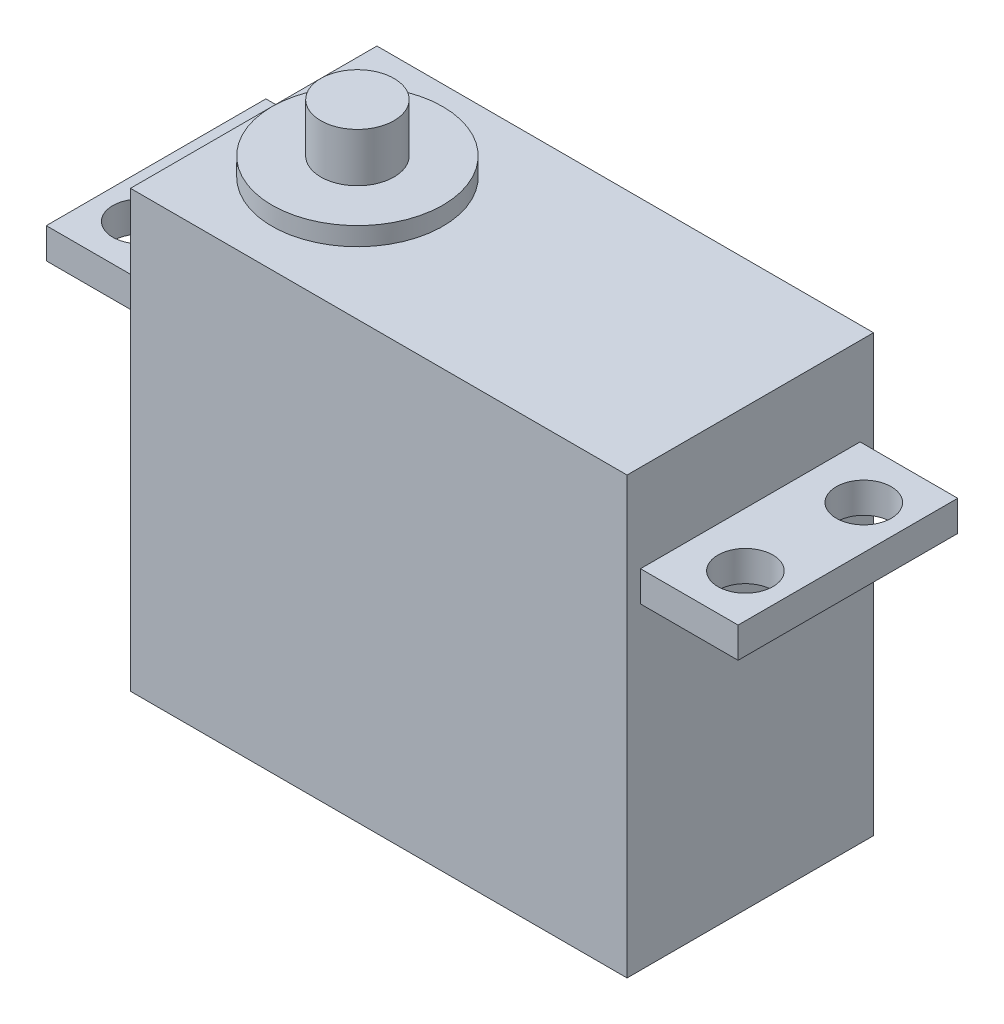
ISO-10303-21;
HEADER;
FILE_DESCRIPTION(('STEP AP214'),'2;1');
FILE_NAME('part.step','',(''),(''),'','','');
FILE_SCHEMA(('AUTOMOTIVE_DESIGN { 1 0 10303 214 1 1 1 1 }'));
ENDSEC;
DATA;
#1=APPLICATION_CONTEXT('core data for automotive mechanical design processes');
#2=APPLICATION_PROTOCOL_DEFINITION('international standard','automotive_design',2000,#1);
#3=PRODUCT_CONTEXT('',#1,'mechanical');
#4=PRODUCT('Part','Part','',(#3));
#5=PRODUCT_RELATED_PRODUCT_CATEGORY('part','',(#4));
#6=PRODUCT_DEFINITION_FORMATION('','',#4);
#7=PRODUCT_DEFINITION_CONTEXT('part definition',#1,'design');
#8=PRODUCT_DEFINITION('design','',#6,#7);
#9=PRODUCT_DEFINITION_SHAPE('','',#8);
#10=(LENGTH_UNIT() NAMED_UNIT(*) SI_UNIT(.MILLI.,.METRE.));
#11=(NAMED_UNIT(*) PLANE_ANGLE_UNIT() SI_UNIT($,.RADIAN.));
#12=(NAMED_UNIT(*) SI_UNIT($,.STERADIAN.) SOLID_ANGLE_UNIT());
#13=UNCERTAINTY_MEASURE_WITH_UNIT(LENGTH_MEASURE(1.E-05),#10,'distance_accuracy_value','');
#14=(GEOMETRIC_REPRESENTATION_CONTEXT(3) GLOBAL_UNCERTAINTY_ASSIGNED_CONTEXT((#13)) GLOBAL_UNIT_ASSIGNED_CONTEXT((#10,
#11,#12)) REPRESENTATION_CONTEXT('',''));
#15=CARTESIAN_POINT('',(0.,0.,0.));
#16=DIRECTION('',(0.,0.,1.));
#17=DIRECTION('',(1.,0.,0.));
#18=AXIS2_PLACEMENT_3D('',#15,#16,#17);
#19=CARTESIAN_POINT('',(0.,0.,20.2));
#20=DIRECTION('',(1.,0.,0.));
#21=DIRECTION('',(0.,1.,0.));
#22=AXIS2_PLACEMENT_3D('',#19,#20,#21);
#23=PLANE('',#22);
#24=DIRECTION('',(0.,-1.,0.));
#25=VECTOR('',#24,1.);
#26=CARTESIAN_POINT('',(0.,0.,0.));
#27=LINE('',#26,#25);
#28=CARTESIAN_POINT('',(0.,35.7,0.));
#29=VERTEX_POINT('',#28);
#30=CARTESIAN_POINT('',(0.,0.,0.));
#31=VERTEX_POINT('',#30);
#32=EDGE_CURVE('E251',#29,#31,#27,.T.);
#33=ORIENTED_EDGE('',*,*,#32,.T.);
#34=DIRECTION('',(0.,0.,-1.));
#35=VECTOR('',#34,1.);
#36=CARTESIAN_POINT('',(0.,0.,20.2));
#37=LINE('',#36,#35);
#38=CARTESIAN_POINT('',(0.,0.,20.2));
#39=VERTEX_POINT('',#38);
#40=EDGE_CURVE('E278',#39,#31,#37,.T.);
#41=ORIENTED_EDGE('',*,*,#40,.F.);
#42=DIRECTION('',(0.,-1.,0.));
#43=VECTOR('',#42,1.);
#44=CARTESIAN_POINT('',(0.,0.,20.2));
#45=LINE('',#44,#43);
#46=CARTESIAN_POINT('',(0.,35.7,20.2));
#47=VERTEX_POINT('',#46);
#48=EDGE_CURVE('E252',#47,#39,#45,.T.);
#49=ORIENTED_EDGE('',*,*,#48,.F.);
#50=DIRECTION('',(0.,0.,-1.));
#51=VECTOR('',#50,1.);
#52=CARTESIAN_POINT('',(0.,35.7,20.2));
#53=LINE('',#52,#51);
#54=EDGE_CURVE('E262',#47,#29,#53,.T.);
#55=ORIENTED_EDGE('',*,*,#54,.T.);
#56=EDGE_LOOP('',(#33,#41,#49,#55));
#57=FACE_BOUND('',#56,.T.);
#58=DIRECTION('',(0.,0.,1.));
#59=VECTOR('',#58,1.);
#60=CARTESIAN_POINT('',(0.,28.5,20.2));
#61=LINE('',#60,#59);
#62=CARTESIAN_POINT('',(0.,28.5,1.1));
#63=VERTEX_POINT('',#62);
#64=CARTESIAN_POINT('',(0.,28.5,19.1));
#65=VERTEX_POINT('',#64);
#66=EDGE_CURVE('E245',#63,#65,#61,.T.);
#67=ORIENTED_EDGE('',*,*,#66,.T.);
#68=DIRECTION('',(0.,-1.,0.));
#69=VECTOR('',#68,1.);
#70=CARTESIAN_POINT('',(0.,0.,19.1));
#71=LINE('',#70,#69);
#72=CARTESIAN_POINT('',(0.,26.,19.1));
#73=VERTEX_POINT('',#72);
#74=EDGE_CURVE('E248',#65,#73,#71,.T.);
#75=ORIENTED_EDGE('',*,*,#74,.T.);
#76=DIRECTION('',(0.,0.,-1.));
#77=VECTOR('',#76,1.);
#78=CARTESIAN_POINT('',(0.,26.,20.2));
#79=LINE('',#78,#77);
#80=CARTESIAN_POINT('',(0.,26.,1.1));
#81=VERTEX_POINT('',#80);
#82=EDGE_CURVE('E228',#73,#81,#79,.T.);
#83=ORIENTED_EDGE('',*,*,#82,.T.);
#84=DIRECTION('',(0.,1.,0.));
#85=VECTOR('',#84,1.);
#86=CARTESIAN_POINT('',(0.,0.,1.1));
#87=LINE('',#86,#85);
#88=EDGE_CURVE('E242',#81,#63,#87,.T.);
#89=ORIENTED_EDGE('',*,*,#88,.T.);
#90=EDGE_LOOP('',(#67,#75,#83,#89));
#91=FACE_BOUND('',#90,.T.);
#92=DIRECTION('',(0.,-1.,0.));
#93=VECTOR('',#92,1.);
#94=CARTESIAN_POINT('',(0.,4.5,7.1));
#95=LINE('',#94,#93);
#96=CARTESIAN_POINT('',(0.,4.5,7.1));
#97=VERTEX_POINT('',#96);
#98=CARTESIAN_POINT('',(0.,1.,7.1));
#99=VERTEX_POINT('',#98);
#100=EDGE_CURVE('E168',#97,#99,#95,.T.);
#101=ORIENTED_EDGE('',*,*,#100,.F.);
#102=DIRECTION('',(0.,0.,-1.));
#103=VECTOR('',#102,1.);
#104=CARTESIAN_POINT('',(0.,4.5,7.1));
#105=LINE('',#104,#103);
#106=CARTESIAN_POINT('',(0.,4.5,13.1));
#107=VERTEX_POINT('',#106);
#108=EDGE_CURVE('E165',#107,#97,#105,.T.);
#109=ORIENTED_EDGE('',*,*,#108,.F.);
#110=DIRECTION('',(0.,1.,0.));
#111=VECTOR('',#110,1.);
#112=CARTESIAN_POINT('',(0.,4.5,13.1));
#113=LINE('',#112,#111);
#114=CARTESIAN_POINT('',(0.,1.,13.1));
#115=VERTEX_POINT('',#114);
#116=EDGE_CURVE('E55',#115,#107,#113,.T.);
#117=ORIENTED_EDGE('',*,*,#116,.F.);
#118=DIRECTION('',(0.,0.,1.));
#119=VECTOR('',#118,1.);
#120=CARTESIAN_POINT('',(0.,1.,7.1));
#121=LINE('',#120,#119);
#122=EDGE_CURVE('E50',#99,#115,#121,.T.);
#123=ORIENTED_EDGE('',*,*,#122,.F.);
#124=EDGE_LOOP('',(#101,#109,#117,#123));
#125=FACE_BOUND('',#124,.T.);
#126=ADVANCED_FACE('F35',(#57,#91,#125),#23,.F.);
#127=CARTESIAN_POINT('',(0.,0.,20.2));
#128=DIRECTION('',(0.,1.,0.));
#129=DIRECTION('',(0.,0.,1.));
#130=AXIS2_PLACEMENT_3D('',#127,#128,#129);
#131=PLANE('',#130);
#132=DIRECTION('',(1.,0.,0.));
#133=VECTOR('',#132,1.);
#134=CARTESIAN_POINT('',(0.,0.,0.));
#135=LINE('',#134,#133);
#136=CARTESIAN_POINT('',(40.7,0.,0.));
#137=VERTEX_POINT('',#136);
#138=EDGE_CURVE('E265',#31,#137,#135,.T.);
#139=ORIENTED_EDGE('',*,*,#138,.T.);
#140=DIRECTION('',(0.,0.,-1.));
#141=VECTOR('',#140,1.);
#142=CARTESIAN_POINT('',(40.7,0.,20.2));
#143=LINE('',#142,#141);
#144=CARTESIAN_POINT('',(40.7,0.,20.2));
#145=VERTEX_POINT('',#144);
#146=EDGE_CURVE('E275',#145,#137,#143,.T.);
#147=ORIENTED_EDGE('',*,*,#146,.F.);
#148=DIRECTION('',(1.,0.,0.));
#149=VECTOR('',#148,1.);
#150=CARTESIAN_POINT('',(0.,0.,20.2));
#151=LINE('',#150,#149);
#152=EDGE_CURVE('E255',#39,#145,#151,.T.);
#153=ORIENTED_EDGE('',*,*,#152,.F.);
#154=ORIENTED_EDGE('',*,*,#40,.T.);
#155=EDGE_LOOP('',(#139,#147,#153,#154));
#156=FACE_BOUND('',#155,.T.);
#157=ADVANCED_FACE('F332',(#156),#131,.F.);
#158=CARTESIAN_POINT('',(40.7,0.,20.2));
#159=DIRECTION('',(-1.,0.,0.));
#160=DIRECTION('',(0.,-1.,0.));
#161=AXIS2_PLACEMENT_3D('',#158,#159,#160);
#162=PLANE('',#161);
#163=DIRECTION('',(0.,0.,1.));
#164=VECTOR('',#163,1.);
#165=CARTESIAN_POINT('',(40.7,26.,20.2));
#166=LINE('',#165,#164);
#167=CARTESIAN_POINT('',(40.7,26.,1.1));
#168=VERTEX_POINT('',#167);
#169=CARTESIAN_POINT('',(40.7,26.,19.1));
#170=VERTEX_POINT('',#169);
#171=EDGE_CURVE('E281',#168,#170,#166,.T.);
#172=ORIENTED_EDGE('',*,*,#171,.T.);
#173=DIRECTION('',(0.,1.,0.));
#174=VECTOR('',#173,1.);
#175=CARTESIAN_POINT('',(40.7,0.,19.1));
#176=LINE('',#175,#174);
#177=CARTESIAN_POINT('',(40.7,28.5,19.1));
#178=VERTEX_POINT('',#177);
#179=EDGE_CURVE('E290',#170,#178,#176,.T.);
#180=ORIENTED_EDGE('',*,*,#179,.T.);
#181=DIRECTION('',(0.,0.,-1.));
#182=VECTOR('',#181,1.);
#183=CARTESIAN_POINT('',(40.7,28.5,20.2));
#184=LINE('',#183,#182);
#185=CARTESIAN_POINT('',(40.7,28.5,1.1));
#186=VERTEX_POINT('',#185);
#187=EDGE_CURVE('E287',#178,#186,#184,.T.);
#188=ORIENTED_EDGE('',*,*,#187,.T.);
#189=DIRECTION('',(0.,-1.,0.));
#190=VECTOR('',#189,1.);
#191=CARTESIAN_POINT('',(40.7,0.,1.1));
#192=LINE('',#191,#190);
#193=EDGE_CURVE('E284',#186,#168,#192,.T.);
#194=ORIENTED_EDGE('',*,*,#193,.T.);
#195=EDGE_LOOP('',(#172,#180,#188,#194));
#196=FACE_BOUND('',#195,.T.);
#197=DIRECTION('',(0.,1.,0.));
#198=VECTOR('',#197,1.);
#199=CARTESIAN_POINT('',(40.7,0.,0.));
#200=LINE('',#199,#198);
#201=CARTESIAN_POINT('',(40.7,35.7,0.));
#202=VERTEX_POINT('',#201);
#203=EDGE_CURVE('E267',#137,#202,#200,.T.);
#204=ORIENTED_EDGE('',*,*,#203,.T.);
#205=DIRECTION('',(0.,0.,-1.));
#206=VECTOR('',#205,1.);
#207=CARTESIAN_POINT('',(40.7,35.7,20.2));
#208=LINE('',#207,#206);
#209=CARTESIAN_POINT('',(40.7,35.7,20.2));
#210=VERTEX_POINT('',#209);
#211=EDGE_CURVE('E272',#210,#202,#208,.T.);
#212=ORIENTED_EDGE('',*,*,#211,.F.);
#213=DIRECTION('',(0.,1.,0.));
#214=VECTOR('',#213,1.);
#215=CARTESIAN_POINT('',(40.7,0.,20.2));
#216=LINE('',#215,#214);
#217=EDGE_CURVE('E258',#145,#210,#216,.T.);
#218=ORIENTED_EDGE('',*,*,#217,.F.);
#219=ORIENTED_EDGE('',*,*,#146,.T.);
#220=EDGE_LOOP('',(#204,#212,#218,#219));
#221=FACE_BOUND('',#220,.T.);
#222=ADVANCED_FACE('F337',(#196,#221),#162,.F.);
#223=CARTESIAN_POINT('',(0.,35.7,20.2));
#224=DIRECTION('',(0.,-1.,0.));
#225=DIRECTION('',(0.,0.,-1.));
#226=AXIS2_PLACEMENT_3D('',#223,#224,#225);
#227=PLANE('',#226);
#228=CARTESIAN_POINT('',(8.49999999999999,35.7,10.1));
#229=DIRECTION('',(0.,-1.,0.));
#230=DIRECTION('',(0.,0.,-1.));
#231=AXIS2_PLACEMENT_3D('',#228,#229,#230);
#232=CIRCLE('',#231,7.);
#233=CARTESIAN_POINT('',(8.49999999999999,35.7,3.1));
#234=VERTEX_POINT('',#233);
#235=EDGE_CURVE('E38',#234,#234,#232,.F.);
#236=ORIENTED_EDGE('',*,*,#235,.F.);
#237=EDGE_LOOP('',(#236));
#238=FACE_BOUND('',#237,.T.);
#239=DIRECTION('',(-1.,0.,0.));
#240=VECTOR('',#239,1.);
#241=CARTESIAN_POINT('',(0.,35.7,0.));
#242=LINE('',#241,#240);
#243=EDGE_CURVE('E256',#202,#29,#242,.T.);
#244=ORIENTED_EDGE('',*,*,#243,.T.);
#245=ORIENTED_EDGE('',*,*,#54,.F.);
#246=DIRECTION('',(-1.,0.,0.));
#247=VECTOR('',#246,1.);
#248=CARTESIAN_POINT('',(0.,35.7,20.2));
#249=LINE('',#248,#247);
#250=EDGE_CURVE('E260',#210,#47,#249,.T.);
#251=ORIENTED_EDGE('',*,*,#250,.F.);
#252=ORIENTED_EDGE('',*,*,#211,.T.);
#253=EDGE_LOOP('',(#244,#245,#251,#252));
#254=FACE_BOUND('',#253,.T.);
#255=ADVANCED_FACE('F354',(#238,#254),#227,.F.);
#256=CARTESIAN_POINT('',(0.,0.,20.2));
#257=DIRECTION('',(0.,0.,-1.));
#258=DIRECTION('',(-1.,0.,0.));
#259=AXIS2_PLACEMENT_3D('',#256,#257,#258);
#260=PLANE('',#259);
#261=ORIENTED_EDGE('',*,*,#48,.T.);
#262=ORIENTED_EDGE('',*,*,#152,.T.);
#263=ORIENTED_EDGE('',*,*,#217,.T.);
#264=ORIENTED_EDGE('',*,*,#250,.T.);
#265=EDGE_LOOP('',(#261,#262,#263,#264));
#266=FACE_BOUND('',#265,.T.);
#267=ADVANCED_FACE('F350',(#266),#260,.F.);
#268=CARTESIAN_POINT('',(0.,0.,0.));
#269=DIRECTION('',(0.,0.,-1.));
#270=DIRECTION('',(-1.,0.,0.));
#271=AXIS2_PLACEMENT_3D('',#268,#269,#270);
#272=PLANE('',#271);
#273=ORIENTED_EDGE('',*,*,#32,.F.);
#274=ORIENTED_EDGE('',*,*,#243,.F.);
#275=ORIENTED_EDGE('',*,*,#203,.F.);
#276=ORIENTED_EDGE('',*,*,#138,.F.);
#277=EDGE_LOOP('',(#273,#274,#275,#276));
#278=FACE_BOUND('',#277,.T.);
#279=ADVANCED_FACE('F345',(#278),#272,.T.);
#280=CARTESIAN_POINT('',(48.7,0.,0.));
#281=DIRECTION('',(1.,0.,0.));
#282=DIRECTION('',(0.,0.,-1.));
#283=AXIS2_PLACEMENT_3D('',#280,#281,#282);
#284=PLANE('',#283);
#285=DIRECTION('',(0.,-1.,0.));
#286=VECTOR('',#285,1.);
#287=CARTESIAN_POINT('',(48.7,28.5,19.1));
#288=LINE('',#287,#286);
#289=CARTESIAN_POINT('',(48.7,28.5,19.1));
#290=VERTEX_POINT('',#289);
#291=CARTESIAN_POINT('',(48.7,26.,19.1));
#292=VERTEX_POINT('',#291);
#293=EDGE_CURVE('E200',#290,#292,#288,.T.);
#294=ORIENTED_EDGE('',*,*,#293,.T.);
#295=DIRECTION('',(0.,0.,-1.));
#296=VECTOR('',#295,1.);
#297=CARTESIAN_POINT('',(48.7,26.,19.1));
#298=LINE('',#297,#296);
#299=CARTESIAN_POINT('',(48.7,26.,1.1));
#300=VERTEX_POINT('',#299);
#301=EDGE_CURVE('E203',#292,#300,#298,.T.);
#302=ORIENTED_EDGE('',*,*,#301,.T.);
#303=DIRECTION('',(0.,1.,0.));
#304=VECTOR('',#303,1.);
#305=CARTESIAN_POINT('',(48.7,28.5,1.1));
#306=LINE('',#305,#304);
#307=CARTESIAN_POINT('',(48.7,28.5,1.1));
#308=VERTEX_POINT('',#307);
#309=EDGE_CURVE('E206',#300,#308,#306,.T.);
#310=ORIENTED_EDGE('',*,*,#309,.T.);
#311=DIRECTION('',(0.,0.,1.));
#312=VECTOR('',#311,1.);
#313=CARTESIAN_POINT('',(48.7,28.5,19.1));
#314=LINE('',#313,#312);
#315=EDGE_CURVE('E209',#308,#290,#314,.T.);
#316=ORIENTED_EDGE('',*,*,#315,.T.);
#317=EDGE_LOOP('',(#294,#302,#310,#316));
#318=FACE_BOUND('',#317,.T.);
#319=ADVANCED_FACE('F367',(#318),#284,.T.);
#320=CARTESIAN_POINT('',(-8.00000000000001,26.,19.1));
#321=DIRECTION('',(0.,-1.,0.));
#322=DIRECTION('',(1.,0.,0.));
#323=AXIS2_PLACEMENT_3D('',#320,#321,#322);
#324=PLANE('',#323);
#325=CARTESIAN_POINT('',(45.15,26.,14.95));
#326=DIRECTION('',(0.,-1.,0.));
#327=DIRECTION('',(1.,0.,0.));
#328=AXIS2_PLACEMENT_3D('',#325,#326,#327);
#329=CIRCLE('',#328,2.25);
#330=CARTESIAN_POINT('',(47.4,26.,14.95));
#331=VERTEX_POINT('',#330);
#332=EDGE_CURVE('E196',#331,#331,#329,.T.);
#333=ORIENTED_EDGE('',*,*,#332,.F.);
#334=EDGE_LOOP('',(#333));
#335=FACE_BOUND('',#334,.T.);
#336=CARTESIAN_POINT('',(45.15,26.,5.25));
#337=DIRECTION('',(0.,-1.,0.));
#338=DIRECTION('',(1.,0.,0.));
#339=AXIS2_PLACEMENT_3D('',#336,#337,#338);
#340=CIRCLE('',#339,2.25);
#341=CARTESIAN_POINT('',(47.4,26.,5.25));
#342=VERTEX_POINT('',#341);
#343=EDGE_CURVE('E193',#342,#342,#340,.T.);
#344=ORIENTED_EDGE('',*,*,#343,.F.);
#345=EDGE_LOOP('',(#344));
#346=FACE_BOUND('',#345,.T.);
#347=ORIENTED_EDGE('',*,*,#171,.F.);
#348=DIRECTION('',(1.,0.,0.));
#349=VECTOR('',#348,1.);
#350=CARTESIAN_POINT('',(-8.00000000000001,26.,1.1));
#351=LINE('',#350,#349);
#352=EDGE_CURVE('E236',#168,#300,#351,.T.);
#353=ORIENTED_EDGE('',*,*,#352,.T.);
#354=ORIENTED_EDGE('',*,*,#301,.F.);
#355=DIRECTION('',(1.,0.,0.));
#356=VECTOR('',#355,1.);
#357=CARTESIAN_POINT('',(-8.00000000000001,26.,19.1));
#358=LINE('',#357,#356);
#359=EDGE_CURVE('E224',#170,#292,#358,.T.);
#360=ORIENTED_EDGE('',*,*,#359,.F.);
#361=EDGE_LOOP('',(#347,#353,#354,#360));
#362=FACE_BOUND('',#361,.T.);
#363=ADVANCED_FACE('F306',(#335,#346,#362),#324,.T.);
#364=CARTESIAN_POINT('',(-8.00000000000001,28.5,1.1));
#365=DIRECTION('',(0.,0.,-1.));
#366=DIRECTION('',(-1.,0.,0.));
#367=AXIS2_PLACEMENT_3D('',#364,#365,#366);
#368=PLANE('',#367);
#369=ORIENTED_EDGE('',*,*,#193,.F.);
#370=DIRECTION('',(1.,0.,0.));
#371=VECTOR('',#370,1.);
#372=CARTESIAN_POINT('',(-8.00000000000001,28.5,1.1));
#373=LINE('',#372,#371);
#374=EDGE_CURVE('E233',#186,#308,#373,.T.);
#375=ORIENTED_EDGE('',*,*,#374,.T.);
#376=ORIENTED_EDGE('',*,*,#309,.F.);
#377=ORIENTED_EDGE('',*,*,#352,.F.);
#378=EDGE_LOOP('',(#369,#375,#376,#377));
#379=FACE_BOUND('',#378,.T.);
#380=ADVANCED_FACE('F374',(#379),#368,.T.);
#381=CARTESIAN_POINT('',(-8.00000000000001,28.5,19.1));
#382=DIRECTION('',(0.,1.,0.));
#383=DIRECTION('',(-1.,0.,0.));
#384=AXIS2_PLACEMENT_3D('',#381,#382,#383);
#385=PLANE('',#384);
#386=CARTESIAN_POINT('',(45.15,28.5,14.95));
#387=DIRECTION('',(0.,1.,0.));
#388=DIRECTION('',(-1.,0.,0.));
#389=AXIS2_PLACEMENT_3D('',#386,#387,#388);
#390=CIRCLE('',#389,2.25);
#391=CARTESIAN_POINT('',(42.9,28.5,14.95));
#392=VERTEX_POINT('',#391);
#393=EDGE_CURVE('E184',#392,#392,#390,.T.);
#394=ORIENTED_EDGE('',*,*,#393,.F.);
#395=EDGE_LOOP('',(#394));
#396=FACE_BOUND('',#395,.T.);
#397=CARTESIAN_POINT('',(45.15,28.5,5.25));
#398=DIRECTION('',(0.,1.,0.));
#399=DIRECTION('',(-1.,0.,0.));
#400=AXIS2_PLACEMENT_3D('',#397,#398,#399);
#401=CIRCLE('',#400,2.25);
#402=CARTESIAN_POINT('',(42.9,28.5,5.25));
#403=VERTEX_POINT('',#402);
#404=EDGE_CURVE('E187',#403,#403,#401,.T.);
#405=ORIENTED_EDGE('',*,*,#404,.F.);
#406=EDGE_LOOP('',(#405));
#407=FACE_BOUND('',#406,.T.);
#408=ORIENTED_EDGE('',*,*,#187,.F.);
#409=DIRECTION('',(1.,0.,0.));
#410=VECTOR('',#409,1.);
#411=CARTESIAN_POINT('',(-8.00000000000001,28.5,19.1));
#412=LINE('',#411,#410);
#413=EDGE_CURVE('E229',#178,#290,#412,.T.);
#414=ORIENTED_EDGE('',*,*,#413,.T.);
#415=ORIENTED_EDGE('',*,*,#315,.F.);
#416=ORIENTED_EDGE('',*,*,#374,.F.);
#417=EDGE_LOOP('',(#408,#414,#415,#416));
#418=FACE_BOUND('',#417,.T.);
#419=ADVANCED_FACE('F377',(#396,#407,#418),#385,.T.);
#420=CARTESIAN_POINT('',(-8.00000000000001,28.5,19.1));
#421=DIRECTION('',(0.,0.,1.));
#422=DIRECTION('',(1.,0.,0.));
#423=AXIS2_PLACEMENT_3D('',#420,#421,#422);
#424=PLANE('',#423);
#425=ORIENTED_EDGE('',*,*,#179,.F.);
#426=ORIENTED_EDGE('',*,*,#359,.T.);
#427=ORIENTED_EDGE('',*,*,#293,.F.);
#428=ORIENTED_EDGE('',*,*,#413,.F.);
#429=EDGE_LOOP('',(#425,#426,#427,#428));
#430=FACE_BOUND('',#429,.T.);
#431=ADVANCED_FACE('F371',(#430),#424,.T.);
#432=ORIENTED_EDGE('',*,*,#74,.F.);
#433=CARTESIAN_POINT('',(-8.00000000000001,28.5,19.1));
#434=VERTEX_POINT('',#433);
#435=EDGE_CURVE('E225',#434,#65,#412,.T.);
#436=ORIENTED_EDGE('',*,*,#435,.F.);
#437=DIRECTION('',(0.,-1.,0.));
#438=VECTOR('',#437,1.);
#439=CARTESIAN_POINT('',(-8.00000000000001,28.5,19.1));
#440=LINE('',#439,#438);
#441=CARTESIAN_POINT('',(-8.00000000000001,26.,19.1));
#442=VERTEX_POINT('',#441);
#443=EDGE_CURVE('E212',#434,#442,#440,.T.);
#444=ORIENTED_EDGE('',*,*,#443,.T.);
#445=EDGE_CURVE('E237',#442,#73,#358,.T.);
#446=ORIENTED_EDGE('',*,*,#445,.T.);
#447=EDGE_LOOP('',(#432,#436,#444,#446));
#448=FACE_BOUND('',#447,.T.);
#449=ADVANCED_FACE('F313',(#448),#424,.T.);
#450=CARTESIAN_POINT('',(-4.45000000000001,28.5,5.25));
#451=DIRECTION('',(0.,1.,0.));
#452=DIRECTION('',(-1.,0.,0.));
#453=AXIS2_PLACEMENT_3D('',#450,#451,#452);
#454=CIRCLE('',#453,2.25);
#455=CARTESIAN_POINT('',(-6.70000000000001,28.5,5.25));
#456=VERTEX_POINT('',#455);
#457=EDGE_CURVE('E183',#456,#456,#454,.T.);
#458=ORIENTED_EDGE('',*,*,#457,.F.);
#459=EDGE_LOOP('',(#458));
#460=FACE_BOUND('',#459,.T.);
#461=CARTESIAN_POINT('',(-4.45000000000001,28.5,14.95));
#462=DIRECTION('',(0.,1.,0.));
#463=DIRECTION('',(-1.,0.,0.));
#464=AXIS2_PLACEMENT_3D('',#461,#462,#463);
#465=CIRCLE('',#464,2.25);
#466=CARTESIAN_POINT('',(-6.70000000000001,28.5,14.95));
#467=VERTEX_POINT('',#466);
#468=EDGE_CURVE('E180',#467,#467,#465,.T.);
#469=ORIENTED_EDGE('',*,*,#468,.F.);
#470=EDGE_LOOP('',(#469));
#471=FACE_BOUND('',#470,.T.);
#472=ORIENTED_EDGE('',*,*,#66,.F.);
#473=CARTESIAN_POINT('',(-8.00000000000001,28.5,1.1));
#474=VERTEX_POINT('',#473);
#475=EDGE_CURVE('E230',#474,#63,#373,.T.);
#476=ORIENTED_EDGE('',*,*,#475,.F.);
#477=DIRECTION('',(0.,0.,1.));
#478=VECTOR('',#477,1.);
#479=CARTESIAN_POINT('',(-8.00000000000001,28.5,19.1));
#480=LINE('',#479,#478);
#481=EDGE_CURVE('E221',#474,#434,#480,.T.);
#482=ORIENTED_EDGE('',*,*,#481,.T.);
#483=ORIENTED_EDGE('',*,*,#435,.T.);
#484=EDGE_LOOP('',(#472,#476,#482,#483));
#485=FACE_BOUND('',#484,.T.);
#486=ADVANCED_FACE('F316',(#460,#471,#485),#385,.T.);
#487=ORIENTED_EDGE('',*,*,#88,.F.);
#488=CARTESIAN_POINT('',(-8.00000000000001,26.,1.1));
#489=VERTEX_POINT('',#488);
#490=EDGE_CURVE('E234',#489,#81,#351,.T.);
#491=ORIENTED_EDGE('',*,*,#490,.F.);
#492=DIRECTION('',(0.,1.,0.));
#493=VECTOR('',#492,1.);
#494=CARTESIAN_POINT('',(-8.00000000000001,28.5,1.1));
#495=LINE('',#494,#493);
#496=EDGE_CURVE('E218',#489,#474,#495,.T.);
#497=ORIENTED_EDGE('',*,*,#496,.T.);
#498=ORIENTED_EDGE('',*,*,#475,.T.);
#499=EDGE_LOOP('',(#487,#491,#497,#498));
#500=FACE_BOUND('',#499,.T.);
#501=ADVANCED_FACE('F304',(#500),#368,.T.);
#502=CARTESIAN_POINT('',(-4.45000000000001,26.,5.25));
#503=DIRECTION('',(0.,-1.,0.));
#504=DIRECTION('',(1.,0.,0.));
#505=AXIS2_PLACEMENT_3D('',#502,#503,#504);
#506=CIRCLE('',#505,2.25);
#507=CARTESIAN_POINT('',(-2.20000000000001,26.,5.25));
#508=VERTEX_POINT('',#507);
#509=EDGE_CURVE('E197',#508,#508,#506,.T.);
#510=ORIENTED_EDGE('',*,*,#509,.F.);
#511=EDGE_LOOP('',(#510));
#512=FACE_BOUND('',#511,.T.);
#513=CARTESIAN_POINT('',(-4.45000000000001,26.,14.95));
#514=DIRECTION('',(0.,-1.,0.));
#515=DIRECTION('',(1.,0.,0.));
#516=AXIS2_PLACEMENT_3D('',#513,#514,#515);
#517=CIRCLE('',#516,2.25);
#518=CARTESIAN_POINT('',(-2.20000000000001,26.,14.95));
#519=VERTEX_POINT('',#518);
#520=EDGE_CURVE('E192',#519,#519,#517,.T.);
#521=ORIENTED_EDGE('',*,*,#520,.F.);
#522=EDGE_LOOP('',(#521));
#523=FACE_BOUND('',#522,.T.);
#524=ORIENTED_EDGE('',*,*,#82,.F.);
#525=ORIENTED_EDGE('',*,*,#445,.F.);
#526=DIRECTION('',(0.,0.,-1.));
#527=VECTOR('',#526,1.);
#528=CARTESIAN_POINT('',(-8.00000000000001,26.,19.1));
#529=LINE('',#528,#527);
#530=EDGE_CURVE('E215',#442,#489,#529,.T.);
#531=ORIENTED_EDGE('',*,*,#530,.T.);
#532=ORIENTED_EDGE('',*,*,#490,.T.);
#533=EDGE_LOOP('',(#524,#525,#531,#532));
#534=FACE_BOUND('',#533,.T.);
#535=ADVANCED_FACE('F300',(#512,#523,#534),#324,.T.);
#536=CARTESIAN_POINT('',(-8.00000000000001,0.,0.));
#537=DIRECTION('',(1.,0.,0.));
#538=DIRECTION('',(0.,0.,-1.));
#539=AXIS2_PLACEMENT_3D('',#536,#537,#538);
#540=PLANE('',#539);
#541=ORIENTED_EDGE('',*,*,#443,.F.);
#542=ORIENTED_EDGE('',*,*,#481,.F.);
#543=ORIENTED_EDGE('',*,*,#496,.F.);
#544=ORIENTED_EDGE('',*,*,#530,.F.);
#545=EDGE_LOOP('',(#541,#542,#543,#544));
#546=FACE_BOUND('',#545,.T.);
#547=ADVANCED_FACE('F303',(#546),#540,.F.);
#548=CARTESIAN_POINT('',(-4.45000000000001,20.5,14.95));
#549=DIRECTION('',(0.,1.,0.));
#550=DIRECTION('',(-1.,0.,0.));
#551=AXIS2_PLACEMENT_3D('',#548,#549,#550);
#552=CYLINDRICAL_SURFACE('',#551,2.25);
#553=ORIENTED_EDGE('',*,*,#520,.T.);
#554=EDGE_LOOP('',(#553));
#555=FACE_BOUND('',#554,.T.);
#556=ORIENTED_EDGE('',*,*,#468,.T.);
#557=EDGE_LOOP('',(#556));
#558=FACE_BOUND('',#557,.T.);
#559=ADVANCED_FACE('F322',(#555,#558),#552,.F.);
#560=CARTESIAN_POINT('',(-4.45000000000001,20.5,5.25));
#561=DIRECTION('',(0.,1.,0.));
#562=DIRECTION('',(-1.,0.,0.));
#563=AXIS2_PLACEMENT_3D('',#560,#561,#562);
#564=CYLINDRICAL_SURFACE('',#563,2.25);
#565=ORIENTED_EDGE('',*,*,#509,.T.);
#566=EDGE_LOOP('',(#565));
#567=FACE_BOUND('',#566,.T.);
#568=ORIENTED_EDGE('',*,*,#457,.T.);
#569=EDGE_LOOP('',(#568));
#570=FACE_BOUND('',#569,.T.);
#571=ADVANCED_FACE('F297',(#567,#570),#564,.F.);
#572=CARTESIAN_POINT('',(45.15,20.5,5.25));
#573=DIRECTION('',(0.,1.,0.));
#574=DIRECTION('',(-1.,0.,0.));
#575=AXIS2_PLACEMENT_3D('',#572,#573,#574);
#576=CYLINDRICAL_SURFACE('',#575,2.25);
#577=ORIENTED_EDGE('',*,*,#343,.T.);
#578=EDGE_LOOP('',(#577));
#579=FACE_BOUND('',#578,.T.);
#580=ORIENTED_EDGE('',*,*,#404,.T.);
#581=EDGE_LOOP('',(#580));
#582=FACE_BOUND('',#581,.T.);
#583=ADVANCED_FACE('F410',(#579,#582),#576,.F.);
#584=CARTESIAN_POINT('',(45.15,20.5,14.95));
#585=DIRECTION('',(0.,1.,0.));
#586=DIRECTION('',(-1.,0.,0.));
#587=AXIS2_PLACEMENT_3D('',#584,#585,#586);
#588=CYLINDRICAL_SURFACE('',#587,2.25);
#589=ORIENTED_EDGE('',*,*,#332,.T.);
#590=EDGE_LOOP('',(#589));
#591=FACE_BOUND('',#590,.T.);
#592=ORIENTED_EDGE('',*,*,#393,.T.);
#593=EDGE_LOOP('',(#592));
#594=FACE_BOUND('',#593,.T.);
#595=ADVANCED_FACE('F413',(#591,#594),#588,.F.);
#596=CARTESIAN_POINT('',(8.49999999999999,37.2,10.1));
#597=DIRECTION('',(0.,-1.,0.));
#598=DIRECTION('',(0.,0.,-1.));
#599=AXIS2_PLACEMENT_3D('',#596,#597,#598);
#600=CYLINDRICAL_SURFACE('',#599,7.);
#601=CARTESIAN_POINT('',(8.49999999999999,37.2,10.1));
#602=DIRECTION('',(0.,1.,0.));
#603=DIRECTION('',(0.,0.,1.));
#604=AXIS2_PLACEMENT_3D('',#601,#602,#603);
#605=CIRCLE('',#604,7.);
#606=CARTESIAN_POINT('',(8.49999999999999,37.2,17.1));
#607=VERTEX_POINT('',#606);
#608=EDGE_CURVE('E172',#607,#607,#605,.T.);
#609=ORIENTED_EDGE('',*,*,#608,.F.);
#610=EDGE_LOOP('',(#609));
#611=FACE_BOUND('',#610,.T.);
#612=ORIENTED_EDGE('',*,*,#235,.T.);
#613=EDGE_LOOP('',(#612));
#614=FACE_BOUND('',#613,.T.);
#615=ADVANCED_FACE('F418',(#611,#614),#600,.T.);
#616=CARTESIAN_POINT('',(8.49999999999999,37.2,10.1));
#617=DIRECTION('',(0.,1.,0.));
#618=DIRECTION('',(0.,0.,1.));
#619=AXIS2_PLACEMENT_3D('',#616,#617,#618);
#620=PLANE('',#619);
#621=CARTESIAN_POINT('',(8.49999999999999,37.2,10.1));
#622=DIRECTION('',(0.,1.,0.));
#623=DIRECTION('',(0.,0.,1.));
#624=AXIS2_PLACEMENT_3D('',#621,#622,#623);
#625=CIRCLE('',#624,3.);
#626=CARTESIAN_POINT('',(8.49999999999999,37.2,13.1));
#627=VERTEX_POINT('',#626);
#628=EDGE_CURVE('E11',#627,#627,#625,.T.);
#629=ORIENTED_EDGE('',*,*,#628,.F.);
#630=EDGE_LOOP('',(#629));
#631=FACE_BOUND('',#630,.T.);
#632=ORIENTED_EDGE('',*,*,#608,.T.);
#633=EDGE_LOOP('',(#632));
#634=FACE_BOUND('',#633,.T.);
#635=ADVANCED_FACE('F423',(#631,#634),#620,.T.);
#636=CARTESIAN_POINT('',(8.49999999999999,41.2,10.1));
#637=DIRECTION('',(0.,-1.,0.));
#638=DIRECTION('',(0.,0.,-1.));
#639=AXIS2_PLACEMENT_3D('',#636,#637,#638);
#640=CYLINDRICAL_SURFACE('',#639,3.);
#641=CARTESIAN_POINT('',(8.49999999999999,41.2,10.1));
#642=DIRECTION('',(0.,1.,0.));
#643=DIRECTION('',(0.,0.,1.));
#644=AXIS2_PLACEMENT_3D('',#641,#642,#643);
#645=CIRCLE('',#644,3.);
#646=CARTESIAN_POINT('',(8.49999999999999,41.2,13.1));
#647=VERTEX_POINT('',#646);
#648=EDGE_CURVE('E169',#647,#647,#645,.T.);
#649=ORIENTED_EDGE('',*,*,#648,.F.);
#650=EDGE_LOOP('',(#649));
#651=FACE_BOUND('',#650,.T.);
#652=ORIENTED_EDGE('',*,*,#628,.T.);
#653=EDGE_LOOP('',(#652));
#654=FACE_BOUND('',#653,.T.);
#655=ADVANCED_FACE('F427',(#651,#654),#640,.T.);
#656=CARTESIAN_POINT('',(8.49999999999999,41.2,10.1));
#657=DIRECTION('',(0.,1.,0.));
#658=DIRECTION('',(0.,0.,1.));
#659=AXIS2_PLACEMENT_3D('',#656,#657,#658);
#660=PLANE('',#659);
#661=ORIENTED_EDGE('',*,*,#648,.T.);
#662=EDGE_LOOP('',(#661));
#663=FACE_BOUND('',#662,.T.);
#664=ADVANCED_FACE('F431',(#663),#660,.T.);
#665=CARTESIAN_POINT('',(-4.,4.5,7.1));
#666=DIRECTION('',(0.,0.,1.));
#667=DIRECTION('',(1.,0.,0.));
#668=AXIS2_PLACEMENT_3D('',#665,#666,#667);
#669=PLANE('',#668);
#670=ORIENTED_EDGE('',*,*,#100,.T.);
#671=DIRECTION('',(1.,0.,0.));
#672=VECTOR('',#671,1.);
#673=CARTESIAN_POINT('',(-4.,0.999999999999999,7.1));
#674=LINE('',#673,#672);
#675=CARTESIAN_POINT('',(-4.,0.999999999999999,7.1));
#676=VERTEX_POINT('',#675);
#677=EDGE_CURVE('E149',#676,#99,#674,.T.);
#678=ORIENTED_EDGE('',*,*,#677,.F.);
#679=DIRECTION('',(0.,-1.,0.));
#680=VECTOR('',#679,1.);
#681=CARTESIAN_POINT('',(-4.,4.5,7.1));
#682=LINE('',#681,#680);
#683=CARTESIAN_POINT('',(-4.,4.5,7.1));
#684=VERTEX_POINT('',#683);
#685=EDGE_CURVE('E156',#684,#676,#682,.T.);
#686=ORIENTED_EDGE('',*,*,#685,.F.);
#687=DIRECTION('',(1.,0.,0.));
#688=VECTOR('',#687,1.);
#689=CARTESIAN_POINT('',(-4.,4.5,7.1));
#690=LINE('',#689,#688);
#691=EDGE_CURVE('E613',#684,#97,#690,.T.);
#692=ORIENTED_EDGE('',*,*,#691,.T.);
#693=EDGE_LOOP('',(#670,#678,#686,#692));
#694=FACE_BOUND('',#693,.T.);
#695=ADVANCED_FACE('F167',(#694),#669,.F.);
#696=CARTESIAN_POINT('',(-4.,0.999999999999999,7.1));
#697=DIRECTION('',(0.,1.,0.));
#698=DIRECTION('',(-1.,0.,0.));
#699=AXIS2_PLACEMENT_3D('',#696,#697,#698);
#700=PLANE('',#699);
#701=ORIENTED_EDGE('',*,*,#122,.T.);
#702=DIRECTION('',(1.,0.,0.));
#703=VECTOR('',#702,1.);
#704=CARTESIAN_POINT('',(-4.,1.,13.1));
#705=LINE('',#704,#703);
#706=CARTESIAN_POINT('',(-4.,1.,13.1));
#707=VERTEX_POINT('',#706);
#708=EDGE_CURVE('E152',#707,#115,#705,.T.);
#709=ORIENTED_EDGE('',*,*,#708,.F.);
#710=DIRECTION('',(0.,0.,1.));
#711=VECTOR('',#710,1.);
#712=CARTESIAN_POINT('',(-4.,0.999999999999999,7.1));
#713=LINE('',#712,#711);
#714=EDGE_CURVE('E145',#676,#707,#713,.T.);
#715=ORIENTED_EDGE('',*,*,#714,.F.);
#716=ORIENTED_EDGE('',*,*,#677,.T.);
#717=EDGE_LOOP('',(#701,#709,#715,#716));
#718=FACE_BOUND('',#717,.T.);
#719=ADVANCED_FACE('F147',(#718),#700,.F.);
#720=CARTESIAN_POINT('',(-4.,4.5,13.1));
#721=DIRECTION('',(0.,0.,-1.));
#722=DIRECTION('',(-1.,0.,0.));
#723=AXIS2_PLACEMENT_3D('',#720,#721,#722);
#724=PLANE('',#723);
#725=ORIENTED_EDGE('',*,*,#116,.T.);
#726=DIRECTION('',(1.,0.,0.));
#727=VECTOR('',#726,1.);
#728=CARTESIAN_POINT('',(-4.,4.5,13.1));
#729=LINE('',#728,#727);
#730=CARTESIAN_POINT('',(-4.,4.5,13.1));
#731=VERTEX_POINT('',#730);
#732=EDGE_CURVE('E174',#731,#107,#729,.T.);
#733=ORIENTED_EDGE('',*,*,#732,.F.);
#734=DIRECTION('',(0.,1.,0.));
#735=VECTOR('',#734,1.);
#736=CARTESIAN_POINT('',(-4.,4.5,13.1));
#737=LINE('',#736,#735);
#738=EDGE_CURVE('E155',#707,#731,#737,.T.);
#739=ORIENTED_EDGE('',*,*,#738,.F.);
#740=ORIENTED_EDGE('',*,*,#708,.T.);
#741=EDGE_LOOP('',(#725,#733,#739,#740));
#742=FACE_BOUND('',#741,.T.);
#743=ADVANCED_FACE('F440',(#742),#724,.F.);
#744=CARTESIAN_POINT('',(-4.,4.5,7.1));
#745=DIRECTION('',(0.,-1.,0.));
#746=DIRECTION('',(0.,0.,-1.));
#747=AXIS2_PLACEMENT_3D('',#744,#745,#746);
#748=PLANE('',#747);
#749=ORIENTED_EDGE('',*,*,#108,.T.);
#750=ORIENTED_EDGE('',*,*,#691,.F.);
#751=DIRECTION('',(0.,0.,-1.));
#752=VECTOR('',#751,1.);
#753=CARTESIAN_POINT('',(-4.,4.5,7.1));
#754=LINE('',#753,#752);
#755=EDGE_CURVE('E161',#731,#684,#754,.T.);
#756=ORIENTED_EDGE('',*,*,#755,.F.);
#757=ORIENTED_EDGE('',*,*,#732,.T.);
#758=EDGE_LOOP('',(#749,#750,#756,#757));
#759=FACE_BOUND('',#758,.T.);
#760=ADVANCED_FACE('F443',(#759),#748,.F.);
#761=CARTESIAN_POINT('',(-4.,0.,0.));
#762=DIRECTION('',(-1.,0.,0.));
#763=DIRECTION('',(0.,-1.,0.));
#764=AXIS2_PLACEMENT_3D('',#761,#762,#763);
#765=PLANE('',#764);
#766=ORIENTED_EDGE('',*,*,#685,.T.);
#767=ORIENTED_EDGE('',*,*,#714,.T.);
#768=ORIENTED_EDGE('',*,*,#738,.T.);
#769=ORIENTED_EDGE('',*,*,#755,.T.);
#770=EDGE_LOOP('',(#766,#767,#768,#769));
#771=FACE_BOUND('',#770,.T.);
#772=ADVANCED_FACE('F159',(#771),#765,.T.);
#773=CLOSED_SHELL('',(#126,#157,#222,#255,#267,#279,#319,#363,#380,#419,#431,#449,#486,#501,
#535,#547,#559,#571,#583,#595,#615,#635,#655,#664,#695,#719,#743,#760,#772));
#774=MANIFOLD_SOLID_BREP('B2',#773);
#775=ADVANCED_BREP_SHAPE_REPRESENTATION('',(#18,#774),#14);
#776=SHAPE_DEFINITION_REPRESENTATION(#9,#775);
ENDSEC;
END-ISO-10303-21;
